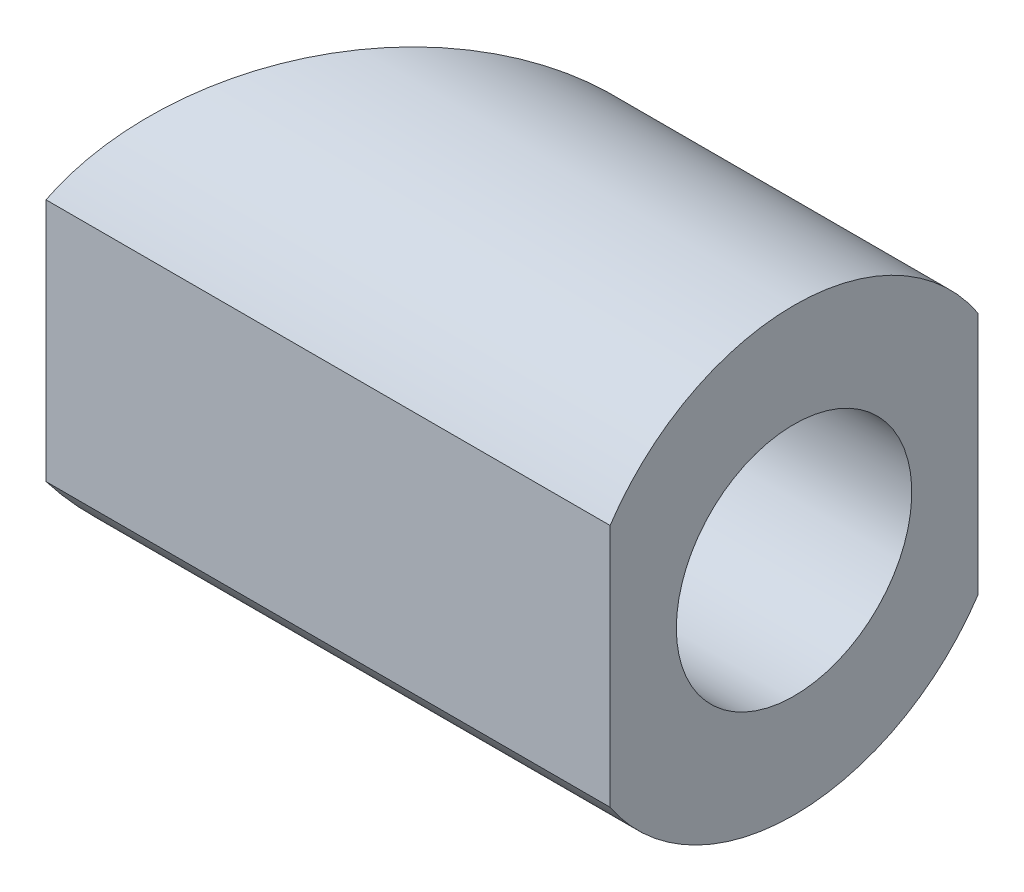
ISO-10303-21;
HEADER;
FILE_DESCRIPTION(('STEP AP214'),'2;1');
FILE_NAME('part.step','',(''),(''),'','','');
FILE_SCHEMA(('AUTOMOTIVE_DESIGN { 1 0 10303 214 1 1 1 1 }'));
ENDSEC;
DATA;
#1=APPLICATION_CONTEXT('core data for automotive mechanical design processes');
#2=APPLICATION_PROTOCOL_DEFINITION('international standard','automotive_design',2000,#1);
#3=PRODUCT_CONTEXT('',#1,'mechanical');
#4=PRODUCT('Part','Part','',(#3));
#5=PRODUCT_RELATED_PRODUCT_CATEGORY('part','',(#4));
#6=PRODUCT_DEFINITION_FORMATION('','',#4);
#7=PRODUCT_DEFINITION_CONTEXT('part definition',#1,'design');
#8=PRODUCT_DEFINITION('design','',#6,#7);
#9=PRODUCT_DEFINITION_SHAPE('','',#8);
#10=(LENGTH_UNIT() NAMED_UNIT(*) SI_UNIT(.MILLI.,.METRE.));
#11=(NAMED_UNIT(*) PLANE_ANGLE_UNIT() SI_UNIT($,.RADIAN.));
#12=(NAMED_UNIT(*) SI_UNIT($,.STERADIAN.) SOLID_ANGLE_UNIT());
#13=UNCERTAINTY_MEASURE_WITH_UNIT(LENGTH_MEASURE(1.E-05),#10,'distance_accuracy_value','');
#14=(GEOMETRIC_REPRESENTATION_CONTEXT(3) GLOBAL_UNCERTAINTY_ASSIGNED_CONTEXT((#13)) GLOBAL_UNIT_ASSIGNED_CONTEXT((#10,
#11,#12)) REPRESENTATION_CONTEXT('',''));
#15=CARTESIAN_POINT('',(0.,0.,0.));
#16=DIRECTION('',(0.,0.,1.));
#17=DIRECTION('',(1.,0.,0.));
#18=AXIS2_PLACEMENT_3D('',#15,#16,#17);
#19=CARTESIAN_POINT('',(0.,0.,0.));
#20=DIRECTION('',(-1.,0.,0.));
#21=DIRECTION('',(0.,0.,1.));
#22=AXIS2_PLACEMENT_3D('',#19,#20,#21);
#23=CYLINDRICAL_SURFACE('',#22,3.);
#24=CARTESIAN_POINT('',(4.,0.,0.));
#25=DIRECTION('',(-1.,0.,0.));
#26=DIRECTION('',(0.,0.,1.));
#27=AXIS2_PLACEMENT_3D('',#24,#25,#26);
#28=CIRCLE('',#27,3.);
#29=CARTESIAN_POINT('',(4.,-1.6583123951777,-2.5));
#30=VERTEX_POINT('',#29);
#31=CARTESIAN_POINT('',(4.,-1.6583123951777,2.5));
#32=VERTEX_POINT('',#31);
#33=EDGE_CURVE('E94',#30,#32,#28,.T.);
#34=ORIENTED_EDGE('',*,*,#33,.T.);
#35=DIRECTION('',(-1.,0.,0.));
#36=VECTOR('',#35,1.);
#37=CARTESIAN_POINT('',(0.,-1.6583123951777,2.5));
#38=LINE('',#37,#36);
#39=CARTESIAN_POINT('',(-3.66666666666667,-1.6583123951777,2.5));
#40=VERTEX_POINT('',#39);
#41=EDGE_CURVE('E92',#32,#40,#38,.T.);
#42=ORIENTED_EDGE('',*,*,#41,.T.);
#43=CARTESIAN_POINT('',(-2.,0.,0.));
#44=DIRECTION('',(0.832050294337844,0.,0.554700196225229));
#45=DIRECTION('',(-0.554700196225229,0.,0.832050294337844));
#46=AXIS2_PLACEMENT_3D('',#43,#44,#45);
#47=ELLIPSE('',#46,3.60555127546399,3.);
#48=CARTESIAN_POINT('',(-0.333333333333334,-1.6583123951777,-2.5));
#49=VERTEX_POINT('',#48);
#50=EDGE_CURVE('E91',#40,#49,#47,.T.);
#51=ORIENTED_EDGE('',*,*,#50,.T.);
#52=DIRECTION('',(-1.,0.,0.));
#53=VECTOR('',#52,1.);
#54=CARTESIAN_POINT('',(0.,-1.6583123951777,-2.5));
#55=LINE('',#54,#53);
#56=EDGE_CURVE('E58',#49,#30,#55,.F.);
#57=ORIENTED_EDGE('',*,*,#56,.T.);
#58=EDGE_LOOP('',(#34,#42,#51,#57));
#59=FACE_BOUND('',#58,.T.);
#60=ADVANCED_FACE('F36',(#59),#23,.T.);
#61=CARTESIAN_POINT('',(0.,0.,0.));
#62=DIRECTION('',(-1.,0.,0.));
#63=DIRECTION('',(0.,0.,1.));
#64=AXIS2_PLACEMENT_3D('',#61,#62,#63);
#65=PLANE('',#64);
#66=CARTESIAN_POINT('',(0.,0.,0.));
#67=DIRECTION('',(-1.,0.,0.));
#68=DIRECTION('',(0.,0.,1.));
#69=AXIS2_PLACEMENT_3D('',#66,#67,#68);
#70=CIRCLE('',#69,1.6);
#71=CARTESIAN_POINT('',(0.,0.,1.6));
#72=VERTEX_POINT('',#71);
#73=EDGE_CURVE('E81',#72,#72,#70,.T.);
#74=ORIENTED_EDGE('',*,*,#73,.F.);
#75=EDGE_LOOP('',(#74));
#76=FACE_BOUND('',#75,.T.);
#77=ADVANCED_FACE('F38',(#76),#65,.F.);
#78=CARTESIAN_POINT('',(0.,0.,0.));
#79=DIRECTION('',(-1.,0.,0.));
#80=DIRECTION('',(0.,0.,1.));
#81=AXIS2_PLACEMENT_3D('',#78,#79,#80);
#82=CYLINDRICAL_SURFACE('',#81,1.6);
#83=CARTESIAN_POINT('',(4.,0.,0.));
#84=DIRECTION('',(-1.,0.,0.));
#85=DIRECTION('',(0.,0.,1.));
#86=AXIS2_PLACEMENT_3D('',#83,#84,#85);
#87=CIRCLE('',#86,1.6);
#88=CARTESIAN_POINT('',(4.,0.,1.6));
#89=VERTEX_POINT('',#88);
#90=EDGE_CURVE('E101',#89,#89,#87,.T.);
#91=ORIENTED_EDGE('',*,*,#90,.F.);
#92=EDGE_LOOP('',(#91));
#93=FACE_BOUND('',#92,.T.);
#94=ORIENTED_EDGE('',*,*,#73,.T.);
#95=EDGE_LOOP('',(#94));
#96=FACE_BOUND('',#95,.T.);
#97=ADVANCED_FACE('F107',(#93,#96),#82,.F.);
#98=CARTESIAN_POINT('',(4.,1.6,0.));
#99=DIRECTION('',(-1.,0.,0.));
#100=DIRECTION('',(0.,0.,1.));
#101=AXIS2_PLACEMENT_3D('',#98,#99,#100);
#102=PLANE('',#101);
#103=CARTESIAN_POINT('',(4.,1.6583123951777,2.5));
#104=VERTEX_POINT('',#103);
#105=CARTESIAN_POINT('',(4.,1.6583123951777,-2.5));
#106=VERTEX_POINT('',#105);
#107=EDGE_CURVE('E88',#104,#106,#28,.T.);
#108=ORIENTED_EDGE('',*,*,#107,.F.);
#109=DIRECTION('',(0.,1.,0.));
#110=VECTOR('',#109,1.);
#111=CARTESIAN_POINT('',(4.,-3.,2.5));
#112=LINE('',#111,#110);
#113=EDGE_CURVE('E134',#32,#104,#112,.T.);
#114=ORIENTED_EDGE('',*,*,#113,.F.);
#115=ORIENTED_EDGE('',*,*,#33,.F.);
#116=DIRECTION('',(0.,1.,0.));
#117=VECTOR('',#116,1.);
#118=CARTESIAN_POINT('',(4.,-3.,-2.5));
#119=LINE('',#118,#117);
#120=EDGE_CURVE('E135',#30,#106,#119,.T.);
#121=ORIENTED_EDGE('',*,*,#120,.T.);
#122=EDGE_LOOP('',(#108,#114,#115,#121));
#123=FACE_BOUND('',#122,.T.);
#124=ORIENTED_EDGE('',*,*,#90,.T.);
#125=EDGE_LOOP('',(#124));
#126=FACE_BOUND('',#125,.T.);
#127=ADVANCED_FACE('F114',(#123,#126),#102,.F.);
#128=CARTESIAN_POINT('',(-0.333333333333334,1.6583123951777,-2.5));
#129=VERTEX_POINT('',#128);
#130=CARTESIAN_POINT('',(-3.66666666666667,1.6583123951777,2.5));
#131=VERTEX_POINT('',#130);
#132=EDGE_CURVE('E86',#129,#131,#47,.T.);
#133=ORIENTED_EDGE('',*,*,#132,.T.);
#134=DIRECTION('',(-1.,0.,0.));
#135=VECTOR('',#134,1.);
#136=CARTESIAN_POINT('',(0.,1.6583123951777,2.5));
#137=LINE('',#136,#135);
#138=EDGE_CURVE('E51',#131,#104,#137,.F.);
#139=ORIENTED_EDGE('',*,*,#138,.T.);
#140=ORIENTED_EDGE('',*,*,#107,.T.);
#141=DIRECTION('',(-1.,0.,0.));
#142=VECTOR('',#141,1.);
#143=CARTESIAN_POINT('',(0.,1.6583123951777,-2.5));
#144=LINE('',#143,#142);
#145=EDGE_CURVE('E75',#106,#129,#144,.T.);
#146=ORIENTED_EDGE('',*,*,#145,.T.);
#147=EDGE_LOOP('',(#133,#139,#140,#146));
#148=FACE_BOUND('',#147,.T.);
#149=ADVANCED_FACE('F85',(#148),#23,.T.);
#150=CARTESIAN_POINT('',(-4.,-3.,3.));
#151=DIRECTION('',(0.832050294337844,0.,0.554700196225229));
#152=DIRECTION('',(0.554700196225229,0.,-0.832050294337844));
#153=AXIS2_PLACEMENT_3D('',#150,#151,#152);
#154=PLANE('',#153);
#155=ORIENTED_EDGE('',*,*,#50,.F.);
#156=DIRECTION('',(0.,1.,0.));
#157=VECTOR('',#156,1.);
#158=CARTESIAN_POINT('',(-3.66666666666667,-3.,2.5));
#159=LINE('',#158,#157);
#160=EDGE_CURVE('E11',#40,#131,#159,.T.);
#161=ORIENTED_EDGE('',*,*,#160,.T.);
#162=ORIENTED_EDGE('',*,*,#132,.F.);
#163=DIRECTION('',(0.,-1.,0.));
#164=VECTOR('',#163,1.);
#165=CARTESIAN_POINT('',(-0.333333333333334,-3.,-2.5));
#166=LINE('',#165,#164);
#167=EDGE_CURVE('E44',#129,#49,#166,.T.);
#168=ORIENTED_EDGE('',*,*,#167,.T.);
#169=EDGE_LOOP('',(#155,#161,#162,#168));
#170=FACE_BOUND('',#169,.T.);
#171=ADVANCED_FACE('F90',(#170),#154,.F.);
#172=CARTESIAN_POINT('',(4.,-3.,-2.5));
#173=DIRECTION('',(0.,0.,1.));
#174=DIRECTION('',(1.,0.,0.));
#175=AXIS2_PLACEMENT_3D('',#172,#173,#174);
#176=PLANE('',#175);
#177=ORIENTED_EDGE('',*,*,#120,.F.);
#178=ORIENTED_EDGE('',*,*,#56,.F.);
#179=ORIENTED_EDGE('',*,*,#167,.F.);
#180=ORIENTED_EDGE('',*,*,#145,.F.);
#181=EDGE_LOOP('',(#177,#178,#179,#180));
#182=FACE_BOUND('',#181,.T.);
#183=ADVANCED_FACE('F74',(#182),#176,.F.);
#184=CARTESIAN_POINT('',(4.,-3.,2.5));
#185=DIRECTION('',(0.,0.,-1.));
#186=DIRECTION('',(-1.,0.,0.));
#187=AXIS2_PLACEMENT_3D('',#184,#185,#186);
#188=PLANE('',#187);
#189=ORIENTED_EDGE('',*,*,#113,.T.);
#190=ORIENTED_EDGE('',*,*,#138,.F.);
#191=ORIENTED_EDGE('',*,*,#160,.F.);
#192=ORIENTED_EDGE('',*,*,#41,.F.);
#193=EDGE_LOOP('',(#189,#190,#191,#192));
#194=FACE_BOUND('',#193,.T.);
#195=ADVANCED_FACE('F139',(#194),#188,.F.);
#196=CLOSED_SHELL('',(#60,#77,#97,#127,#149,#171,#183,#195));
#197=MANIFOLD_SOLID_BREP('B2',#196);
#198=ADVANCED_BREP_SHAPE_REPRESENTATION('',(#18,#197),#14);
#199=SHAPE_DEFINITION_REPRESENTATION(#9,#198);
ENDSEC;
END-ISO-10303-21;
